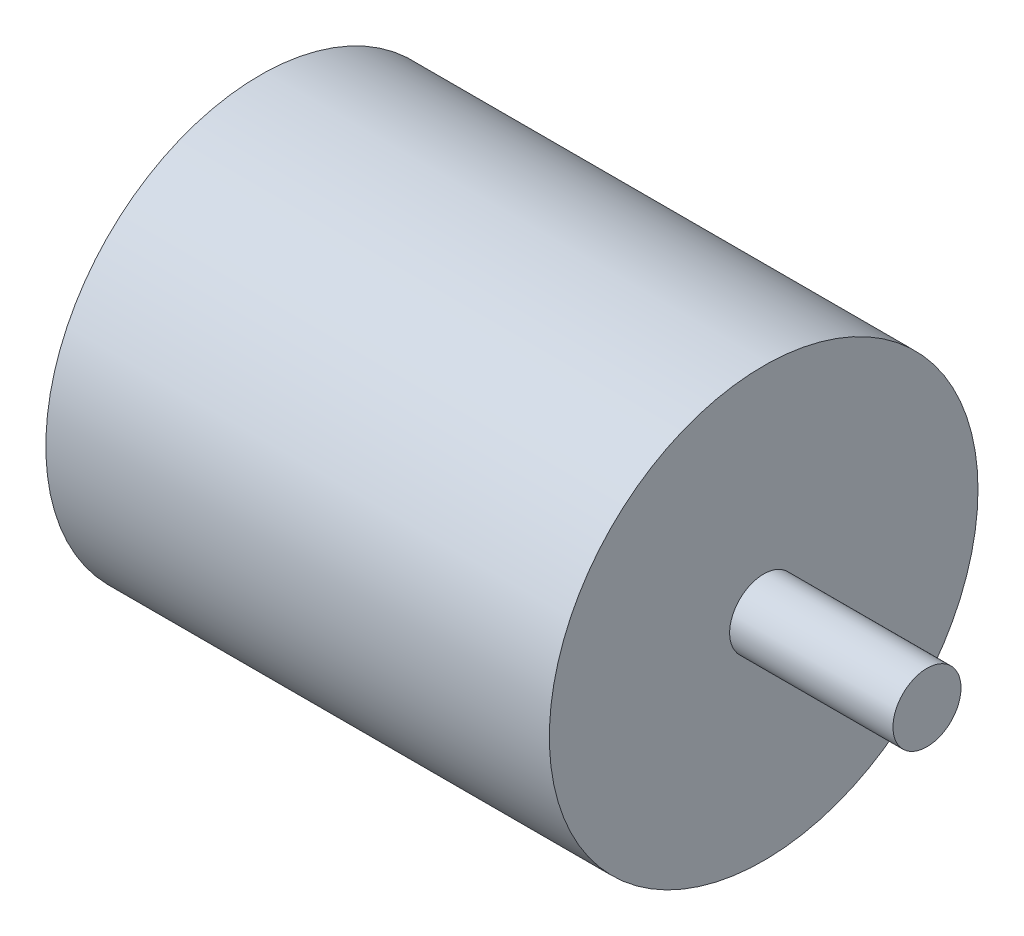
ISO-10303-21;
HEADER;
FILE_DESCRIPTION(('STEP AP214'),'2;1');
FILE_NAME('part.step','',(''),(''),'','','');
FILE_SCHEMA(('AUTOMOTIVE_DESIGN { 1 0 10303 214 1 1 1 1 }'));
ENDSEC;
DATA;
#1=APPLICATION_CONTEXT('core data for automotive mechanical design processes');
#2=APPLICATION_PROTOCOL_DEFINITION('international standard','automotive_design',2000,#1);
#3=PRODUCT_CONTEXT('',#1,'mechanical');
#4=PRODUCT('Part','Part','',(#3));
#5=PRODUCT_RELATED_PRODUCT_CATEGORY('part','',(#4));
#6=PRODUCT_DEFINITION_FORMATION('','',#4);
#7=PRODUCT_DEFINITION_CONTEXT('part definition',#1,'design');
#8=PRODUCT_DEFINITION('design','',#6,#7);
#9=PRODUCT_DEFINITION_SHAPE('','',#8);
#10=(LENGTH_UNIT() NAMED_UNIT(*) SI_UNIT(.MILLI.,.METRE.));
#11=(NAMED_UNIT(*) PLANE_ANGLE_UNIT() SI_UNIT($,.RADIAN.));
#12=(NAMED_UNIT(*) SI_UNIT($,.STERADIAN.) SOLID_ANGLE_UNIT());
#13=UNCERTAINTY_MEASURE_WITH_UNIT(LENGTH_MEASURE(1.E-05),#10,'distance_accuracy_value','');
#14=(GEOMETRIC_REPRESENTATION_CONTEXT(3) GLOBAL_UNCERTAINTY_ASSIGNED_CONTEXT((#13)) GLOBAL_UNIT_ASSIGNED_CONTEXT((#10,
#11,#12)) REPRESENTATION_CONTEXT('',''));
#15=CARTESIAN_POINT('',(0.,0.,0.));
#16=DIRECTION('',(0.,0.,1.));
#17=DIRECTION('',(1.,0.,0.));
#18=AXIS2_PLACEMENT_3D('',#15,#16,#17);
#19=CARTESIAN_POINT('',(74.,0.,0.));
#20=DIRECTION('',(1.,0.,0.));
#21=DIRECTION('',(0.,0.,-1.));
#22=AXIS2_PLACEMENT_3D('',#19,#20,#21);
#23=PLANE('',#22);
#24=CARTESIAN_POINT('',(74.,0.,0.));
#25=DIRECTION('',(1.,0.,0.));
#26=DIRECTION('',(0.,0.,-1.));
#27=AXIS2_PLACEMENT_3D('',#24,#25,#26);
#28=CIRCLE('',#27,31.5);
#29=CARTESIAN_POINT('',(74.,0.,-31.5));
#30=VERTEX_POINT('',#29);
#31=EDGE_CURVE('E10',#30,#30,#28,.T.);
#32=ORIENTED_EDGE('',*,*,#31,.T.);
#33=EDGE_LOOP('',(#32));
#34=FACE_BOUND('',#33,.T.);
#35=CARTESIAN_POINT('',(74.,0.,0.));
#36=DIRECTION('',(1.,0.,0.));
#37=DIRECTION('',(0.,0.,-1.));
#38=AXIS2_PLACEMENT_3D('',#35,#36,#37);
#39=CIRCLE('',#38,5.);
#40=CARTESIAN_POINT('',(74.,0.,-5.));
#41=VERTEX_POINT('',#40);
#42=EDGE_CURVE('E44',#41,#41,#39,.T.);
#43=ORIENTED_EDGE('',*,*,#42,.F.);
#44=EDGE_LOOP('',(#43));
#45=FACE_BOUND('',#44,.T.);
#46=ADVANCED_FACE('F31',(#34,#45),#23,.T.);
#47=CARTESIAN_POINT('',(74.,0.,0.));
#48=DIRECTION('',(-1.,0.,0.));
#49=DIRECTION('',(0.,0.,1.));
#50=AXIS2_PLACEMENT_3D('',#47,#48,#49);
#51=CYLINDRICAL_SURFACE('',#50,31.5);
#52=ORIENTED_EDGE('',*,*,#31,.F.);
#53=EDGE_LOOP('',(#52));
#54=FACE_BOUND('',#53,.T.);
#55=CARTESIAN_POINT('',(0.,0.,0.));
#56=DIRECTION('',(1.,0.,0.));
#57=DIRECTION('',(0.,0.,-1.));
#58=AXIS2_PLACEMENT_3D('',#55,#56,#57);
#59=CIRCLE('',#58,31.5);
#60=CARTESIAN_POINT('',(0.,0.,-31.5));
#61=VERTEX_POINT('',#60);
#62=EDGE_CURVE('E35',#61,#61,#59,.T.);
#63=ORIENTED_EDGE('',*,*,#62,.T.);
#64=EDGE_LOOP('',(#63));
#65=FACE_BOUND('',#64,.T.);
#66=ADVANCED_FACE('F33',(#54,#65),#51,.T.);
#67=CARTESIAN_POINT('',(0.,0.,0.));
#68=DIRECTION('',(1.,0.,0.));
#69=DIRECTION('',(0.,0.,-1.));
#70=AXIS2_PLACEMENT_3D('',#67,#68,#69);
#71=PLANE('',#70);
#72=ORIENTED_EDGE('',*,*,#62,.F.);
#73=EDGE_LOOP('',(#72));
#74=FACE_BOUND('',#73,.T.);
#75=ADVANCED_FACE('F55',(#74),#71,.F.);
#76=CARTESIAN_POINT('',(98.,0.,0.));
#77=DIRECTION('',(-1.,0.,0.));
#78=DIRECTION('',(0.,0.,1.));
#79=AXIS2_PLACEMENT_3D('',#76,#77,#78);
#80=CYLINDRICAL_SURFACE('',#79,5.);
#81=CARTESIAN_POINT('',(98.,0.,0.));
#82=DIRECTION('',(1.,0.,0.));
#83=DIRECTION('',(0.,0.,-1.));
#84=AXIS2_PLACEMENT_3D('',#81,#82,#83);
#85=CIRCLE('',#84,5.);
#86=CARTESIAN_POINT('',(98.,0.,-5.));
#87=VERTEX_POINT('',#86);
#88=EDGE_CURVE('E42',#87,#87,#85,.T.);
#89=ORIENTED_EDGE('',*,*,#88,.F.);
#90=EDGE_LOOP('',(#89));
#91=FACE_BOUND('',#90,.T.);
#92=ORIENTED_EDGE('',*,*,#42,.T.);
#93=EDGE_LOOP('',(#92));
#94=FACE_BOUND('',#93,.T.);
#95=ADVANCED_FACE('F52',(#91,#94),#80,.T.);
#96=CARTESIAN_POINT('',(98.,0.,0.));
#97=DIRECTION('',(1.,0.,0.));
#98=DIRECTION('',(0.,0.,-1.));
#99=AXIS2_PLACEMENT_3D('',#96,#97,#98);
#100=PLANE('',#99);
#101=ORIENTED_EDGE('',*,*,#88,.T.);
#102=EDGE_LOOP('',(#101));
#103=FACE_BOUND('',#102,.T.);
#104=ADVANCED_FACE('F50',(#103),#100,.T.);
#105=CLOSED_SHELL('',(#46,#66,#75,#95,#104));
#106=MANIFOLD_SOLID_BREP('B2',#105);
#107=ADVANCED_BREP_SHAPE_REPRESENTATION('',(#18,#106),#14);
#108=SHAPE_DEFINITION_REPRESENTATION(#9,#107);
ENDSEC;
END-ISO-10303-21;
